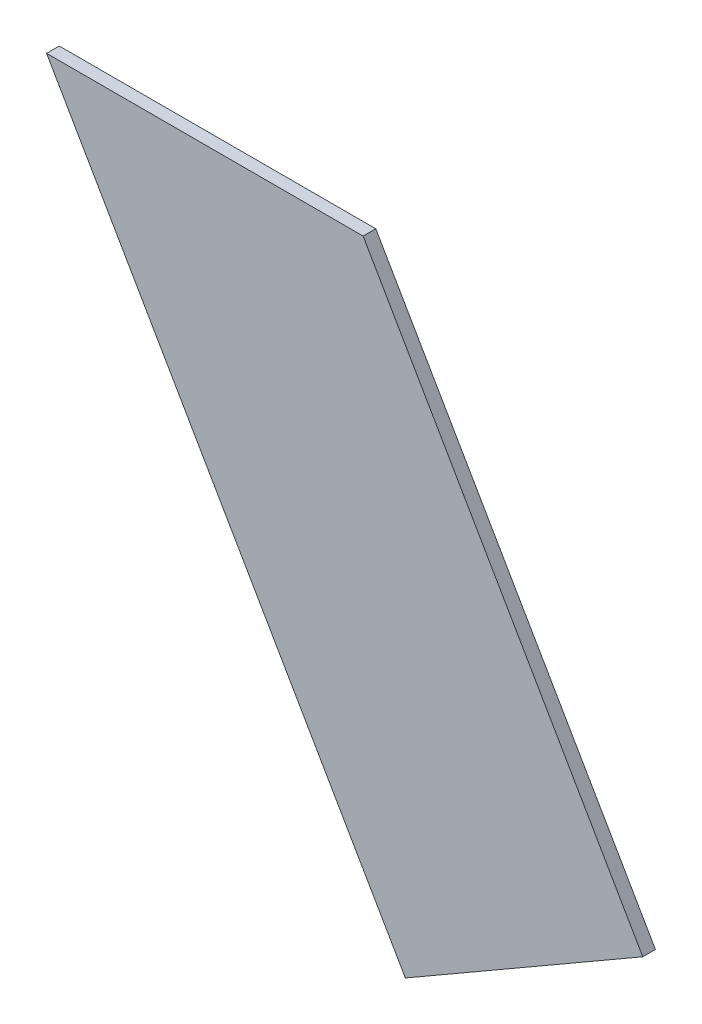
ISO-10303-21;
HEADER;
FILE_DESCRIPTION(('STEP AP214'),'2;1');
FILE_NAME('part.step','',(''),(''),'','','');
FILE_SCHEMA(('AUTOMOTIVE_DESIGN { 1 0 10303 214 1 1 1 1 }'));
ENDSEC;
DATA;
#1=APPLICATION_CONTEXT('core data for automotive mechanical design processes');
#2=APPLICATION_PROTOCOL_DEFINITION('international standard','automotive_design',2000,#1);
#3=PRODUCT_CONTEXT('',#1,'mechanical');
#4=PRODUCT('Part','Part','',(#3));
#5=PRODUCT_RELATED_PRODUCT_CATEGORY('part','',(#4));
#6=PRODUCT_DEFINITION_FORMATION('','',#4);
#7=PRODUCT_DEFINITION_CONTEXT('part definition',#1,'design');
#8=PRODUCT_DEFINITION('design','',#6,#7);
#9=PRODUCT_DEFINITION_SHAPE('','',#8);
#10=(LENGTH_UNIT() NAMED_UNIT(*) SI_UNIT(.MILLI.,.METRE.));
#11=(NAMED_UNIT(*) PLANE_ANGLE_UNIT() SI_UNIT($,.RADIAN.));
#12=(NAMED_UNIT(*) SI_UNIT($,.STERADIAN.) SOLID_ANGLE_UNIT());
#13=UNCERTAINTY_MEASURE_WITH_UNIT(LENGTH_MEASURE(1.E-05),#10,'distance_accuracy_value','');
#14=(GEOMETRIC_REPRESENTATION_CONTEXT(3) GLOBAL_UNCERTAINTY_ASSIGNED_CONTEXT((#13)) GLOBAL_UNIT_ASSIGNED_CONTEXT((#10,
#11,#12)) REPRESENTATION_CONTEXT('',''));
#15=CARTESIAN_POINT('',(0.,0.,0.));
#16=DIRECTION('',(0.,0.,1.));
#17=DIRECTION('',(1.,0.,0.));
#18=AXIS2_PLACEMENT_3D('',#15,#16,#17);
#19=CARTESIAN_POINT('',(-17.3751319348516,-52.4577466526546,3.));
#20=DIRECTION('',(0.86602540378444,0.499999999999998,0.));
#21=DIRECTION('',(-0.499999999999998,0.86602540378444,0.));
#22=AXIS2_PLACEMENT_3D('',#19,#20,#21);
#23=PLANE('',#22);
#24=DIRECTION('',(0.499999999999998,-0.86602540378444,0.));
#25=VECTOR('',#24,1.);
#26=CARTESIAN_POINT('',(-17.3751319348516,-52.4577466526546,0.));
#27=LINE('',#26,#25);
#28=CARTESIAN_POINT('',(-66.6151319348514,32.8284351120369,0.));
#29=VERTEX_POINT('',#28);
#30=CARTESIAN_POINT('',(18.3848680651483,-114.395883531318,0.));
#31=VERTEX_POINT('',#30);
#32=EDGE_CURVE('E74',#29,#31,#27,.T.);
#33=ORIENTED_EDGE('',*,*,#32,.T.);
#34=DIRECTION('',(0.,0.,-1.));
#35=VECTOR('',#34,1.);
#36=CARTESIAN_POINT('',(18.3848680651483,-114.395883531318,3.));
#37=LINE('',#36,#35);
#38=CARTESIAN_POINT('',(18.3848680651483,-114.395883531318,3.));
#39=VERTEX_POINT('',#38);
#40=EDGE_CURVE('E11',#39,#31,#37,.T.);
#41=ORIENTED_EDGE('',*,*,#40,.F.);
#42=DIRECTION('',(0.499999999999998,-0.86602540378444,0.));
#43=VECTOR('',#42,1.);
#44=CARTESIAN_POINT('',(-66.6151319348514,32.8284351120369,3.));
#45=LINE('',#44,#43);
#46=CARTESIAN_POINT('',(-66.6151319348514,32.8284351120369,3.));
#47=VERTEX_POINT('',#46);
#48=EDGE_CURVE('E79',#47,#39,#45,.T.);
#49=ORIENTED_EDGE('',*,*,#48,.F.);
#50=DIRECTION('',(0.,0.,-1.));
#51=VECTOR('',#50,1.);
#52=CARTESIAN_POINT('',(-66.6151319348514,32.8284351120369,3.));
#53=LINE('',#52,#51);
#54=EDGE_CURVE('E94',#47,#29,#53,.T.);
#55=ORIENTED_EDGE('',*,*,#54,.T.);
#56=EDGE_LOOP('',(#33,#41,#49,#55));
#57=FACE_BOUND('',#56,.T.);
#58=ADVANCED_FACE('F34',(#57),#23,.F.);
#59=CARTESIAN_POINT('',(18.3848680651483,-114.395883531318,3.));
#60=DIRECTION('',(-0.499999999999998,0.86602540378444,0.));
#61=DIRECTION('',(-0.86602540378444,-0.499999999999998,0.));
#62=AXIS2_PLACEMENT_3D('',#59,#60,#61);
#63=PLANE('',#62);
#64=DIRECTION('',(0.86602540378444,0.499999999999998,0.));
#65=VECTOR('',#64,1.);
#66=CARTESIAN_POINT('',(18.3848680651483,-114.395883531318,0.));
#67=LINE('',#66,#65);
#68=CARTESIAN_POINT('',(74.6348680651485,-81.9199308894014,0.));
#69=VERTEX_POINT('',#68);
#70=EDGE_CURVE('E90',#31,#69,#67,.T.);
#71=ORIENTED_EDGE('',*,*,#70,.T.);
#72=DIRECTION('',(0.,0.,-1.));
#73=VECTOR('',#72,1.);
#74=CARTESIAN_POINT('',(74.6348680651485,-81.9199308894014,3.));
#75=LINE('',#74,#73);
#76=CARTESIAN_POINT('',(74.6348680651485,-81.9199308894014,3.));
#77=VERTEX_POINT('',#76);
#78=EDGE_CURVE('E42',#77,#69,#75,.T.);
#79=ORIENTED_EDGE('',*,*,#78,.F.);
#80=DIRECTION('',(0.86602540378444,0.499999999999998,0.));
#81=VECTOR('',#80,1.);
#82=CARTESIAN_POINT('',(18.3848680651483,-114.395883531318,3.));
#83=LINE('',#82,#81);
#84=EDGE_CURVE('E82',#39,#77,#83,.T.);
#85=ORIENTED_EDGE('',*,*,#84,.F.);
#86=ORIENTED_EDGE('',*,*,#40,.T.);
#87=EDGE_LOOP('',(#71,#79,#85,#86));
#88=FACE_BOUND('',#87,.T.);
#89=ADVANCED_FACE('F89',(#88),#63,.F.);
#90=CARTESIAN_POINT('',(74.6348680651485,-81.9199308894014,3.));
#91=DIRECTION('',(-0.86602540378444,-0.499999999999998,0.));
#92=DIRECTION('',(0.499999999999998,-0.86602540378444,0.));
#93=AXIS2_PLACEMENT_3D('',#90,#91,#92);
#94=PLANE('',#93);
#95=DIRECTION('',(-0.499999999999998,0.86602540378444,0.));
#96=VECTOR('',#95,1.);
#97=CARTESIAN_POINT('',(74.6348680651485,-81.9199308894014,0.));
#98=LINE('',#97,#96);
#99=CARTESIAN_POINT('',(8.3848680651486,32.8284351120369,0.));
#100=VERTEX_POINT('',#99);
#101=EDGE_CURVE('E67',#69,#100,#98,.T.);
#102=ORIENTED_EDGE('',*,*,#101,.T.);
#103=DIRECTION('',(0.,0.,-1.));
#104=VECTOR('',#103,1.);
#105=CARTESIAN_POINT('',(8.3848680651486,32.8284351120369,3.));
#106=LINE('',#105,#104);
#107=CARTESIAN_POINT('',(8.3848680651486,32.8284351120369,3.));
#108=VERTEX_POINT('',#107);
#109=EDGE_CURVE('E91',#108,#100,#106,.T.);
#110=ORIENTED_EDGE('',*,*,#109,.F.);
#111=DIRECTION('',(-0.499999999999998,0.86602540378444,0.));
#112=VECTOR('',#111,1.);
#113=CARTESIAN_POINT('',(74.6348680651485,-81.9199308894014,3.));
#114=LINE('',#113,#112);
#115=EDGE_CURVE('E86',#77,#108,#114,.T.);
#116=ORIENTED_EDGE('',*,*,#115,.F.);
#117=ORIENTED_EDGE('',*,*,#78,.T.);
#118=EDGE_LOOP('',(#102,#110,#116,#117));
#119=FACE_BOUND('',#118,.T.);
#120=ADVANCED_FACE('F92',(#119),#94,.F.);
#121=CARTESIAN_POINT('',(-66.6151319348514,32.8284351120369,3.));
#122=DIRECTION('',(0.,-1.,0.));
#123=DIRECTION('',(1.,0.,0.));
#124=AXIS2_PLACEMENT_3D('',#121,#122,#123);
#125=PLANE('',#124);
#126=DIRECTION('',(-1.,0.,0.));
#127=VECTOR('',#126,1.);
#128=CARTESIAN_POINT('',(-66.6151319348514,32.8284351120369,0.));
#129=LINE('',#128,#127);
#130=EDGE_CURVE('E101',#100,#29,#129,.T.);
#131=ORIENTED_EDGE('',*,*,#130,.T.);
#132=ORIENTED_EDGE('',*,*,#54,.F.);
#133=DIRECTION('',(-1.,0.,0.));
#134=VECTOR('',#133,1.);
#135=CARTESIAN_POINT('',(-66.6151319348514,32.8284351120369,3.));
#136=LINE('',#135,#134);
#137=EDGE_CURVE('E50',#108,#47,#136,.T.);
#138=ORIENTED_EDGE('',*,*,#137,.F.);
#139=ORIENTED_EDGE('',*,*,#109,.T.);
#140=EDGE_LOOP('',(#131,#132,#138,#139));
#141=FACE_BOUND('',#140,.T.);
#142=ADVANCED_FACE('F106',(#141),#125,.F.);
#143=CARTESIAN_POINT('',(0.,0.,3.));
#144=DIRECTION('',(0.,0.,1.));
#145=DIRECTION('',(1.,0.,0.));
#146=AXIS2_PLACEMENT_3D('',#143,#144,#145);
#147=PLANE('',#146);
#148=ORIENTED_EDGE('',*,*,#48,.T.);
#149=ORIENTED_EDGE('',*,*,#84,.T.);
#150=ORIENTED_EDGE('',*,*,#115,.T.);
#151=ORIENTED_EDGE('',*,*,#137,.T.);
#152=EDGE_LOOP('',(#148,#149,#150,#151));
#153=FACE_BOUND('',#152,.T.);
#154=ADVANCED_FACE('F84',(#153),#147,.T.);
#155=CARTESIAN_POINT('',(0.,0.,0.));
#156=DIRECTION('',(0.,0.,1.));
#157=DIRECTION('',(1.,0.,0.));
#158=AXIS2_PLACEMENT_3D('',#155,#156,#157);
#159=PLANE('',#158);
#160=ORIENTED_EDGE('',*,*,#32,.F.);
#161=ORIENTED_EDGE('',*,*,#130,.F.);
#162=ORIENTED_EDGE('',*,*,#101,.F.);
#163=ORIENTED_EDGE('',*,*,#70,.F.);
#164=EDGE_LOOP('',(#160,#161,#162,#163));
#165=FACE_BOUND('',#164,.T.);
#166=ADVANCED_FACE('F107',(#165),#159,.F.);
#167=CLOSED_SHELL('',(#58,#89,#120,#142,#154,#166));
#168=MANIFOLD_SOLID_BREP('B2',#167);
#169=ADVANCED_BREP_SHAPE_REPRESENTATION('',(#18,#168),#14);
#170=SHAPE_DEFINITION_REPRESENTATION(#9,#169);
ENDSEC;
END-ISO-10303-21;
